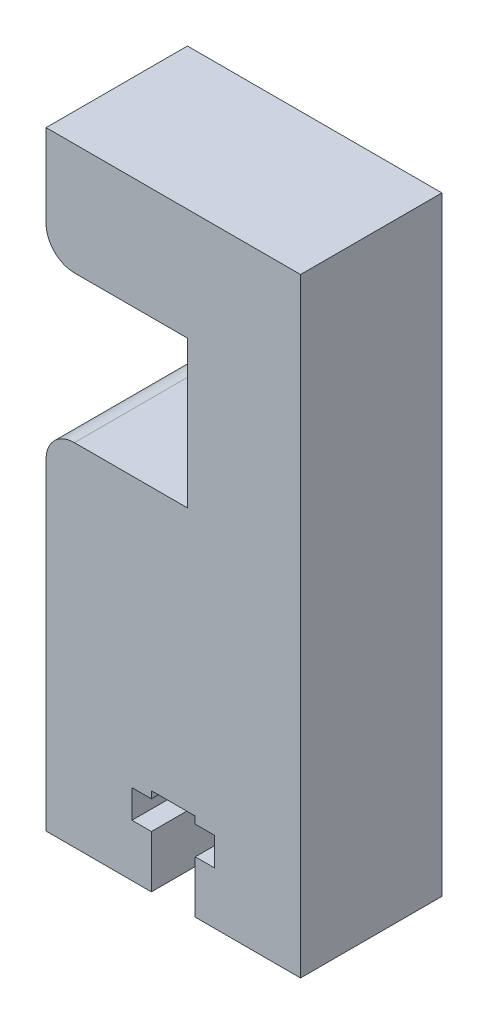
ISO-10303-21;
HEADER;
FILE_DESCRIPTION(('STEP AP214'),'2;1');
FILE_NAME('part.step','',(''),(''),'','','');
FILE_SCHEMA(('AUTOMOTIVE_DESIGN { 1 0 10303 214 1 1 1 1 }'));
ENDSEC;
DATA;
#1=APPLICATION_CONTEXT('core data for automotive mechanical design processes');
#2=APPLICATION_PROTOCOL_DEFINITION('international standard','automotive_design',2000,#1);
#3=PRODUCT_CONTEXT('',#1,'mechanical');
#4=PRODUCT('Part','Part','',(#3));
#5=PRODUCT_RELATED_PRODUCT_CATEGORY('part','',(#4));
#6=PRODUCT_DEFINITION_FORMATION('','',#4);
#7=PRODUCT_DEFINITION_CONTEXT('part definition',#1,'design');
#8=PRODUCT_DEFINITION('design','',#6,#7);
#9=PRODUCT_DEFINITION_SHAPE('','',#8);
#10=(LENGTH_UNIT() NAMED_UNIT(*) SI_UNIT(.MILLI.,.METRE.));
#11=(NAMED_UNIT(*) PLANE_ANGLE_UNIT() SI_UNIT($,.RADIAN.));
#12=(NAMED_UNIT(*) SI_UNIT($,.STERADIAN.) SOLID_ANGLE_UNIT());
#13=UNCERTAINTY_MEASURE_WITH_UNIT(LENGTH_MEASURE(1.E-05),#10,'distance_accuracy_value','');
#14=(GEOMETRIC_REPRESENTATION_CONTEXT(3) GLOBAL_UNCERTAINTY_ASSIGNED_CONTEXT((#13)) GLOBAL_UNIT_ASSIGNED_CONTEXT((#10,
#11,#12)) REPRESENTATION_CONTEXT('',''));
#15=CARTESIAN_POINT('',(0.,0.,0.));
#16=DIRECTION('',(0.,0.,1.));
#17=DIRECTION('',(1.,0.,0.));
#18=AXIS2_PLACEMENT_3D('',#15,#16,#17);
#19=CARTESIAN_POINT('',(-39.1463168418518,3.90000000000001,10.));
#20=DIRECTION('',(0.,1.,0.));
#21=DIRECTION('',(-1.,0.,0.));
#22=AXIS2_PLACEMENT_3D('',#19,#20,#21);
#23=PLANE('',#22);
#24=DIRECTION('',(1.,0.,0.));
#25=VECTOR('',#24,1.);
#26=CARTESIAN_POINT('',(-39.1463168418518,3.90000000000001,0.));
#27=LINE('',#26,#25);
#28=CARTESIAN_POINT('',(-57.1463168418518,3.90000000000001,0.));
#29=VERTEX_POINT('',#28);
#30=CARTESIAN_POINT('',(-49.6963168418518,3.90000000000001,0.));
#31=VERTEX_POINT('',#30);
#32=EDGE_CURVE('E163',#29,#31,#27,.T.);
#33=ORIENTED_EDGE('',*,*,#32,.T.);
#34=DIRECTION('',(0.,0.,1.));
#35=VECTOR('',#34,1.);
#36=CARTESIAN_POINT('',(-49.6963168418518,3.90000000000001,0.));
#37=LINE('',#36,#35);
#38=CARTESIAN_POINT('',(-49.6963168418518,3.90000000000001,10.));
#39=VERTEX_POINT('',#38);
#40=EDGE_CURVE('E160',#31,#39,#37,.T.);
#41=ORIENTED_EDGE('',*,*,#40,.T.);
#42=DIRECTION('',(1.,0.,0.));
#43=VECTOR('',#42,1.);
#44=CARTESIAN_POINT('',(-39.1463168418518,3.90000000000001,10.));
#45=LINE('',#44,#43);
#46=CARTESIAN_POINT('',(-57.1463168418518,3.90000000000001,10.));
#47=VERTEX_POINT('',#46);
#48=EDGE_CURVE('E198',#47,#39,#45,.T.);
#49=ORIENTED_EDGE('',*,*,#48,.F.);
#50=DIRECTION('',(0.,0.,-1.));
#51=VECTOR('',#50,1.);
#52=CARTESIAN_POINT('',(-57.1463168418518,3.90000000000001,10.));
#53=LINE('',#52,#51);
#54=EDGE_CURVE('E42',#47,#29,#53,.T.);
#55=ORIENTED_EDGE('',*,*,#54,.T.);
#56=EDGE_LOOP('',(#33,#41,#49,#55));
#57=FACE_BOUND('',#56,.T.);
#58=ADVANCED_FACE('F34',(#57),#23,.F.);
#59=CARTESIAN_POINT('',(-55.1463168418518,26.7,10.));
#60=DIRECTION('',(0.,0.,-1.));
#61=DIRECTION('',(-1.,0.,0.));
#62=AXIS2_PLACEMENT_3D('',#59,#60,#61);
#63=CYLINDRICAL_SURFACE('',#62,2.);
#64=CARTESIAN_POINT('',(-55.1463168418518,26.7,0.));
#65=DIRECTION('',(0.,0.,1.));
#66=DIRECTION('',(-1.,0.,0.));
#67=AXIS2_PLACEMENT_3D('',#64,#65,#66);
#68=CIRCLE('',#67,2.);
#69=CARTESIAN_POINT('',(-55.1463168418518,28.7,0.));
#70=VERTEX_POINT('',#69);
#71=CARTESIAN_POINT('',(-57.1463168418518,26.7,0.));
#72=VERTEX_POINT('',#71);
#73=EDGE_CURVE('E156',#70,#72,#68,.T.);
#74=ORIENTED_EDGE('',*,*,#73,.T.);
#75=DIRECTION('',(0.,0.,-1.));
#76=VECTOR('',#75,1.);
#77=CARTESIAN_POINT('',(-57.1463168418518,26.7,10.));
#78=LINE('',#77,#76);
#79=CARTESIAN_POINT('',(-57.1463168418518,26.7,10.));
#80=VERTEX_POINT('',#79);
#81=EDGE_CURVE('E11',#80,#72,#78,.T.);
#82=ORIENTED_EDGE('',*,*,#81,.F.);
#83=CARTESIAN_POINT('',(-55.1463168418518,26.7,10.));
#84=DIRECTION('',(0.,0.,1.));
#85=DIRECTION('',(-1.,0.,0.));
#86=AXIS2_PLACEMENT_3D('',#83,#84,#85);
#87=CIRCLE('',#86,2.);
#88=CARTESIAN_POINT('',(-55.1463168418518,28.7,10.));
#89=VERTEX_POINT('',#88);
#90=EDGE_CURVE('E178',#89,#80,#87,.T.);
#91=ORIENTED_EDGE('',*,*,#90,.F.);
#92=DIRECTION('',(0.,0.,-1.));
#93=VECTOR('',#92,1.);
#94=CARTESIAN_POINT('',(-55.1463168418518,28.7,10.));
#95=LINE('',#94,#93);
#96=EDGE_CURVE('E152',#89,#70,#95,.T.);
#97=ORIENTED_EDGE('',*,*,#96,.T.);
#98=EDGE_LOOP('',(#74,#82,#91,#97));
#99=FACE_BOUND('',#98,.T.);
#100=ADVANCED_FACE('F36',(#99),#63,.T.);
#101=CARTESIAN_POINT('',(-57.1463168418518,3.90000000000001,10.));
#102=DIRECTION('',(1.,0.,0.));
#103=DIRECTION('',(0.,0.,-1.));
#104=AXIS2_PLACEMENT_3D('',#101,#102,#103);
#105=PLANE('',#104);
#106=DIRECTION('',(0.,-1.,0.));
#107=VECTOR('',#106,1.);
#108=CARTESIAN_POINT('',(-57.1463168418518,3.90000000000001,0.));
#109=LINE('',#108,#107);
#110=EDGE_CURVE('E159',#72,#29,#109,.T.);
#111=ORIENTED_EDGE('',*,*,#110,.T.);
#112=ORIENTED_EDGE('',*,*,#54,.F.);
#113=DIRECTION('',(0.,-1.,0.));
#114=VECTOR('',#113,1.);
#115=CARTESIAN_POINT('',(-57.1463168418518,3.90000000000001,10.));
#116=LINE('',#115,#114);
#117=EDGE_CURVE('E105',#80,#47,#116,.T.);
#118=ORIENTED_EDGE('',*,*,#117,.F.);
#119=ORIENTED_EDGE('',*,*,#81,.T.);
#120=EDGE_LOOP('',(#111,#112,#118,#119));
#121=FACE_BOUND('',#120,.T.);
#122=ADVANCED_FACE('F441',(#121),#105,.F.);
#123=CARTESIAN_POINT('',(-46.5963168418518,3.90000000000001,10.));
#124=VERTEX_POINT('',#123);
#125=CARTESIAN_POINT('',(-39.1463168418518,3.90000000000001,10.));
#126=VERTEX_POINT('',#125);
#127=EDGE_CURVE('E287',#124,#126,#45,.T.);
#128=ORIENTED_EDGE('',*,*,#127,.F.);
#129=DIRECTION('',(0.,0.,1.));
#130=VECTOR('',#129,1.);
#131=CARTESIAN_POINT('',(-46.5963168418518,3.90000000000001,0.));
#132=LINE('',#131,#130);
#133=CARTESIAN_POINT('',(-46.5963168418518,3.90000000000001,0.));
#134=VERTEX_POINT('',#133);
#135=EDGE_CURVE('E214',#134,#124,#132,.T.);
#136=ORIENTED_EDGE('',*,*,#135,.F.);
#137=CARTESIAN_POINT('',(-39.1463168418518,3.90000000000001,0.));
#138=VERTEX_POINT('',#137);
#139=EDGE_CURVE('E162',#134,#138,#27,.T.);
#140=ORIENTED_EDGE('',*,*,#139,.T.);
#141=DIRECTION('',(0.,0.,-1.));
#142=VECTOR('',#141,1.);
#143=CARTESIAN_POINT('',(-39.1463168418518,3.90000000000001,10.));
#144=LINE('',#143,#142);
#145=EDGE_CURVE('E191',#126,#138,#144,.T.);
#146=ORIENTED_EDGE('',*,*,#145,.F.);
#147=EDGE_LOOP('',(#128,#136,#140,#146));
#148=FACE_BOUND('',#147,.T.);
#149=ADVANCED_FACE('F419',(#148),#23,.F.);
#150=CARTESIAN_POINT('',(-39.1463168418518,3.90000000000001,10.));
#151=DIRECTION('',(-1.,0.,0.));
#152=DIRECTION('',(0.,-1.,0.));
#153=AXIS2_PLACEMENT_3D('',#150,#151,#152);
#154=PLANE('',#153);
#155=DIRECTION('',(0.,1.,0.));
#156=VECTOR('',#155,1.);
#157=CARTESIAN_POINT('',(-39.1463168418518,3.90000000000001,0.));
#158=LINE('',#157,#156);
#159=CARTESIAN_POINT('',(-39.1463168418518,47.,0.));
#160=VERTEX_POINT('',#159);
#161=EDGE_CURVE('E166',#138,#160,#158,.T.);
#162=ORIENTED_EDGE('',*,*,#161,.T.);
#163=DIRECTION('',(0.,0.,-1.));
#164=VECTOR('',#163,1.);
#165=CARTESIAN_POINT('',(-39.1463168418518,47.,10.));
#166=LINE('',#165,#164);
#167=CARTESIAN_POINT('',(-39.1463168418518,47.,10.));
#168=VERTEX_POINT('',#167);
#169=EDGE_CURVE('E188',#168,#160,#166,.T.);
#170=ORIENTED_EDGE('',*,*,#169,.F.);
#171=DIRECTION('',(0.,1.,0.));
#172=VECTOR('',#171,1.);
#173=CARTESIAN_POINT('',(-39.1463168418518,3.90000000000001,10.));
#174=LINE('',#173,#172);
#175=EDGE_CURVE('E289',#126,#168,#174,.T.);
#176=ORIENTED_EDGE('',*,*,#175,.F.);
#177=ORIENTED_EDGE('',*,*,#145,.T.);
#178=EDGE_LOOP('',(#162,#170,#176,#177));
#179=FACE_BOUND('',#178,.T.);
#180=ADVANCED_FACE('F424',(#179),#154,.F.);
#181=CARTESIAN_POINT('',(-39.1463168418518,47.,10.));
#182=DIRECTION('',(0.,-1.,0.));
#183=DIRECTION('',(1.,0.,0.));
#184=AXIS2_PLACEMENT_3D('',#181,#182,#183);
#185=PLANE('',#184);
#186=DIRECTION('',(-1.,0.,0.));
#187=VECTOR('',#186,1.);
#188=CARTESIAN_POINT('',(-39.1463168418518,47.,0.));
#189=LINE('',#188,#187);
#190=CARTESIAN_POINT('',(-57.1463168418518,47.,0.));
#191=VERTEX_POINT('',#190);
#192=EDGE_CURVE('E168',#160,#191,#189,.T.);
#193=ORIENTED_EDGE('',*,*,#192,.T.);
#194=DIRECTION('',(0.,0.,-1.));
#195=VECTOR('',#194,1.);
#196=CARTESIAN_POINT('',(-57.1463168418518,47.,10.));
#197=LINE('',#196,#195);
#198=CARTESIAN_POINT('',(-57.1463168418518,47.,10.));
#199=VERTEX_POINT('',#198);
#200=EDGE_CURVE('E185',#199,#191,#197,.T.);
#201=ORIENTED_EDGE('',*,*,#200,.F.);
#202=DIRECTION('',(-1.,0.,0.));
#203=VECTOR('',#202,1.);
#204=CARTESIAN_POINT('',(-39.1463168418518,47.,10.));
#205=LINE('',#204,#203);
#206=EDGE_CURVE('E291',#168,#199,#205,.T.);
#207=ORIENTED_EDGE('',*,*,#206,.F.);
#208=ORIENTED_EDGE('',*,*,#169,.T.);
#209=EDGE_LOOP('',(#193,#201,#207,#208));
#210=FACE_BOUND('',#209,.T.);
#211=ADVANCED_FACE('F427',(#210),#185,.F.);
#212=CARTESIAN_POINT('',(-57.1463168418518,41.1,10.));
#213=DIRECTION('',(1.,0.,0.));
#214=DIRECTION('',(0.,0.,-1.));
#215=AXIS2_PLACEMENT_3D('',#212,#213,#214);
#216=PLANE('',#215);
#217=DIRECTION('',(0.,-1.,0.));
#218=VECTOR('',#217,1.);
#219=CARTESIAN_POINT('',(-57.1463168418518,41.1,0.));
#220=LINE('',#219,#218);
#221=CARTESIAN_POINT('',(-57.1463168418518,41.1,0.));
#222=VERTEX_POINT('',#221);
#223=EDGE_CURVE('E170',#191,#222,#220,.T.);
#224=ORIENTED_EDGE('',*,*,#223,.T.);
#225=DIRECTION('',(0.,0.,-1.));
#226=VECTOR('',#225,1.);
#227=CARTESIAN_POINT('',(-57.1463168418518,41.1,10.));
#228=LINE('',#227,#226);
#229=CARTESIAN_POINT('',(-57.1463168418518,41.1,10.));
#230=VERTEX_POINT('',#229);
#231=EDGE_CURVE('E182',#230,#222,#228,.T.);
#232=ORIENTED_EDGE('',*,*,#231,.F.);
#233=DIRECTION('',(0.,-1.,0.));
#234=VECTOR('',#233,1.);
#235=CARTESIAN_POINT('',(-57.1463168418518,41.1,10.));
#236=LINE('',#235,#234);
#237=EDGE_CURVE('E293',#199,#230,#236,.T.);
#238=ORIENTED_EDGE('',*,*,#237,.F.);
#239=ORIENTED_EDGE('',*,*,#200,.T.);
#240=EDGE_LOOP('',(#224,#232,#238,#239));
#241=FACE_BOUND('',#240,.T.);
#242=ADVANCED_FACE('F299',(#241),#216,.F.);
#243=CARTESIAN_POINT('',(-55.1463168418518,41.1,10.));
#244=DIRECTION('',(0.,0.,-1.));
#245=DIRECTION('',(-1.,0.,0.));
#246=AXIS2_PLACEMENT_3D('',#243,#244,#245);
#247=CYLINDRICAL_SURFACE('',#246,2.);
#248=CARTESIAN_POINT('',(-55.1463168418518,41.1,0.));
#249=DIRECTION('',(0.,0.,1.));
#250=DIRECTION('',(-1.,0.,0.));
#251=AXIS2_PLACEMENT_3D('',#248,#249,#250);
#252=CIRCLE('',#251,2.);
#253=CARTESIAN_POINT('',(-55.1463168418518,39.1,0.));
#254=VERTEX_POINT('',#253);
#255=EDGE_CURVE('E172',#222,#254,#252,.T.);
#256=ORIENTED_EDGE('',*,*,#255,.T.);
#257=DIRECTION('',(0.,0.,-1.));
#258=VECTOR('',#257,1.);
#259=CARTESIAN_POINT('',(-55.1463168418518,39.1,10.));
#260=LINE('',#259,#258);
#261=CARTESIAN_POINT('',(-55.1463168418518,39.1,10.));
#262=VERTEX_POINT('',#261);
#263=EDGE_CURVE('E147',#262,#254,#260,.T.);
#264=ORIENTED_EDGE('',*,*,#263,.F.);
#265=CARTESIAN_POINT('',(-55.1463168418518,41.1,10.));
#266=DIRECTION('',(0.,0.,1.));
#267=DIRECTION('',(-1.,0.,0.));
#268=AXIS2_PLACEMENT_3D('',#265,#266,#267);
#269=CIRCLE('',#268,2.);
#270=EDGE_CURVE('E135',#230,#262,#269,.T.);
#271=ORIENTED_EDGE('',*,*,#270,.F.);
#272=ORIENTED_EDGE('',*,*,#231,.T.);
#273=EDGE_LOOP('',(#256,#264,#271,#272));
#274=FACE_BOUND('',#273,.T.);
#275=ADVANCED_FACE('F303',(#274),#247,.T.);
#276=CARTESIAN_POINT('',(-55.1463168418518,39.1,10.));
#277=DIRECTION('',(0.,1.,0.));
#278=DIRECTION('',(0.,0.,1.));
#279=AXIS2_PLACEMENT_3D('',#276,#277,#278);
#280=PLANE('',#279);
#281=DIRECTION('',(1.,0.,0.));
#282=VECTOR('',#281,1.);
#283=CARTESIAN_POINT('',(-55.1463168418518,39.1,0.));
#284=LINE('',#283,#282);
#285=CARTESIAN_POINT('',(-47.1463168418518,39.1,0.));
#286=VERTEX_POINT('',#285);
#287=EDGE_CURVE('E144',#254,#286,#284,.T.);
#288=ORIENTED_EDGE('',*,*,#287,.T.);
#289=DIRECTION('',(0.,0.,-1.));
#290=VECTOR('',#289,1.);
#291=CARTESIAN_POINT('',(-47.1463168418518,39.1,10.));
#292=LINE('',#291,#290);
#293=CARTESIAN_POINT('',(-47.1463168418518,39.1,10.));
#294=VERTEX_POINT('',#293);
#295=EDGE_CURVE('E141',#294,#286,#292,.T.);
#296=ORIENTED_EDGE('',*,*,#295,.F.);
#297=DIRECTION('',(1.,0.,0.));
#298=VECTOR('',#297,1.);
#299=CARTESIAN_POINT('',(-55.1463168418518,39.1,10.));
#300=LINE('',#299,#298);
#301=EDGE_CURVE('E127',#262,#294,#300,.T.);
#302=ORIENTED_EDGE('',*,*,#301,.F.);
#303=ORIENTED_EDGE('',*,*,#263,.T.);
#304=EDGE_LOOP('',(#288,#296,#302,#303));
#305=FACE_BOUND('',#304,.T.);
#306=ADVANCED_FACE('F142',(#305),#280,.F.);
#307=CARTESIAN_POINT('',(-47.1463168418518,39.1,10.));
#308=DIRECTION('',(1.,0.,0.));
#309=DIRECTION('',(0.,0.,-1.));
#310=AXIS2_PLACEMENT_3D('',#307,#308,#309);
#311=PLANE('',#310);
#312=DIRECTION('',(0.,-1.,0.));
#313=VECTOR('',#312,1.);
#314=CARTESIAN_POINT('',(-47.1463168418518,39.1,0.));
#315=LINE('',#314,#313);
#316=CARTESIAN_POINT('',(-47.1463168418518,28.7,0.));
#317=VERTEX_POINT('',#316);
#318=EDGE_CURVE('E175',#286,#317,#315,.T.);
#319=ORIENTED_EDGE('',*,*,#318,.T.);
#320=DIRECTION('',(0.,0.,-1.));
#321=VECTOR('',#320,1.);
#322=CARTESIAN_POINT('',(-47.1463168418518,28.7,10.));
#323=LINE('',#322,#321);
#324=CARTESIAN_POINT('',(-47.1463168418518,28.7,10.));
#325=VERTEX_POINT('',#324);
#326=EDGE_CURVE('E148',#325,#317,#323,.T.);
#327=ORIENTED_EDGE('',*,*,#326,.F.);
#328=DIRECTION('',(0.,-1.,0.));
#329=VECTOR('',#328,1.);
#330=CARTESIAN_POINT('',(-47.1463168418518,39.1,10.));
#331=LINE('',#330,#329);
#332=EDGE_CURVE('E132',#294,#325,#331,.T.);
#333=ORIENTED_EDGE('',*,*,#332,.F.);
#334=ORIENTED_EDGE('',*,*,#295,.T.);
#335=EDGE_LOOP('',(#319,#327,#333,#334));
#336=FACE_BOUND('',#335,.T.);
#337=ADVANCED_FACE('F150',(#336),#311,.F.);
#338=CARTESIAN_POINT('',(-55.1463168418518,28.7,10.));
#339=DIRECTION('',(0.,-1.,0.));
#340=DIRECTION('',(1.,0.,0.));
#341=AXIS2_PLACEMENT_3D('',#338,#339,#340);
#342=PLANE('',#341);
#343=DIRECTION('',(-1.,0.,0.));
#344=VECTOR('',#343,1.);
#345=CARTESIAN_POINT('',(-55.1463168418518,28.7,0.));
#346=LINE('',#345,#344);
#347=EDGE_CURVE('E97',#317,#70,#346,.T.);
#348=ORIENTED_EDGE('',*,*,#347,.T.);
#349=ORIENTED_EDGE('',*,*,#96,.F.);
#350=DIRECTION('',(-1.,0.,0.));
#351=VECTOR('',#350,1.);
#352=CARTESIAN_POINT('',(-55.1463168418518,28.7,10.));
#353=LINE('',#352,#351);
#354=EDGE_CURVE('E58',#325,#89,#353,.T.);
#355=ORIENTED_EDGE('',*,*,#354,.F.);
#356=ORIENTED_EDGE('',*,*,#326,.T.);
#357=EDGE_LOOP('',(#348,#349,#355,#356));
#358=FACE_BOUND('',#357,.T.);
#359=ADVANCED_FACE('F304',(#358),#342,.F.);
#360=CARTESIAN_POINT('',(-55.1463168418518,26.7,10.));
#361=DIRECTION('',(0.,0.,-1.));
#362=DIRECTION('',(-1.,0.,0.));
#363=AXIS2_PLACEMENT_3D('',#360,#361,#362);
#364=PLANE('',#363);
#365=ORIENTED_EDGE('',*,*,#48,.T.);
#366=DIRECTION('',(0.,-1.,0.));
#367=VECTOR('',#366,1.);
#368=CARTESIAN_POINT('',(-49.6963168418518,3.90000000000001,10.));
#369=LINE('',#368,#367);
#370=CARTESIAN_POINT('',(-49.6963168418518,7.60000000000001,10.));
#371=VERTEX_POINT('',#370);
#372=EDGE_CURVE('E253',#371,#39,#369,.T.);
#373=ORIENTED_EDGE('',*,*,#372,.F.);
#374=DIRECTION('',(1.,0.,0.));
#375=VECTOR('',#374,1.);
#376=CARTESIAN_POINT('',(-49.6963168418518,7.60000000000001,10.));
#377=LINE('',#376,#375);
#378=CARTESIAN_POINT('',(-51.0713168418518,7.60000000000001,10.));
#379=VERTEX_POINT('',#378);
#380=EDGE_CURVE('E250',#379,#371,#377,.T.);
#381=ORIENTED_EDGE('',*,*,#380,.F.);
#382=DIRECTION('',(0.,-1.,0.));
#383=VECTOR('',#382,1.);
#384=CARTESIAN_POINT('',(-51.0713168418518,7.60000000000001,10.));
#385=LINE('',#384,#383);
#386=CARTESIAN_POINT('',(-51.0713168418518,9.60000000000001,10.));
#387=VERTEX_POINT('',#386);
#388=EDGE_CURVE('E247',#387,#379,#385,.T.);
#389=ORIENTED_EDGE('',*,*,#388,.F.);
#390=DIRECTION('',(-1.,0.,0.));
#391=VECTOR('',#390,1.);
#392=CARTESIAN_POINT('',(-49.6963168418518,9.60000000000001,10.));
#393=LINE('',#392,#391);
#394=CARTESIAN_POINT('',(-49.6963168418518,9.60000000000001,10.));
#395=VERTEX_POINT('',#394);
#396=EDGE_CURVE('E244',#395,#387,#393,.T.);
#397=ORIENTED_EDGE('',*,*,#396,.F.);
#398=DIRECTION('',(0.,-1.,0.));
#399=VECTOR('',#398,1.);
#400=CARTESIAN_POINT('',(-49.6963168418518,9.60000000000001,10.));
#401=LINE('',#400,#399);
#402=CARTESIAN_POINT('',(-49.6963168418518,10.1,10.));
#403=VERTEX_POINT('',#402);
#404=EDGE_CURVE('E241',#403,#395,#401,.T.);
#405=ORIENTED_EDGE('',*,*,#404,.F.);
#406=DIRECTION('',(-1.,0.,0.));
#407=VECTOR('',#406,1.);
#408=CARTESIAN_POINT('',(-46.5963168418518,10.1,10.));
#409=LINE('',#408,#407);
#410=CARTESIAN_POINT('',(-46.5963168418518,10.1,10.));
#411=VERTEX_POINT('',#410);
#412=EDGE_CURVE('E238',#411,#403,#409,.T.);
#413=ORIENTED_EDGE('',*,*,#412,.F.);
#414=DIRECTION('',(0.,1.,0.));
#415=VECTOR('',#414,1.);
#416=CARTESIAN_POINT('',(-46.5963168418518,9.60000000000001,10.));
#417=LINE('',#416,#415);
#418=CARTESIAN_POINT('',(-46.5963168418518,9.60000000000001,10.));
#419=VERTEX_POINT('',#418);
#420=EDGE_CURVE('E235',#419,#411,#417,.T.);
#421=ORIENTED_EDGE('',*,*,#420,.F.);
#422=DIRECTION('',(-1.,0.,0.));
#423=VECTOR('',#422,1.);
#424=CARTESIAN_POINT('',(-45.2213168418518,9.60000000000001,10.));
#425=LINE('',#424,#423);
#426=CARTESIAN_POINT('',(-45.2213168418518,9.60000000000001,10.));
#427=VERTEX_POINT('',#426);
#428=EDGE_CURVE('E232',#427,#419,#425,.T.);
#429=ORIENTED_EDGE('',*,*,#428,.F.);
#430=DIRECTION('',(0.,1.,0.));
#431=VECTOR('',#430,1.);
#432=CARTESIAN_POINT('',(-45.2213168418518,7.60000000000001,10.));
#433=LINE('',#432,#431);
#434=CARTESIAN_POINT('',(-45.2213168418518,7.60000000000001,10.));
#435=VERTEX_POINT('',#434);
#436=EDGE_CURVE('E229',#435,#427,#433,.T.);
#437=ORIENTED_EDGE('',*,*,#436,.F.);
#438=DIRECTION('',(1.,0.,0.));
#439=VECTOR('',#438,1.);
#440=CARTESIAN_POINT('',(-45.2213168418518,7.60000000000001,10.));
#441=LINE('',#440,#439);
#442=CARTESIAN_POINT('',(-46.5963168418518,7.60000000000001,10.));
#443=VERTEX_POINT('',#442);
#444=EDGE_CURVE('E226',#443,#435,#441,.T.);
#445=ORIENTED_EDGE('',*,*,#444,.F.);
#446=DIRECTION('',(0.,1.,0.));
#447=VECTOR('',#446,1.);
#448=CARTESIAN_POINT('',(-46.5963168418518,3.90000000000001,10.));
#449=LINE('',#448,#447);
#450=EDGE_CURVE('E223',#124,#443,#449,.T.);
#451=ORIENTED_EDGE('',*,*,#450,.F.);
#452=ORIENTED_EDGE('',*,*,#127,.T.);
#453=ORIENTED_EDGE('',*,*,#175,.T.);
#454=ORIENTED_EDGE('',*,*,#206,.T.);
#455=ORIENTED_EDGE('',*,*,#237,.T.);
#456=ORIENTED_EDGE('',*,*,#270,.T.);
#457=ORIENTED_EDGE('',*,*,#301,.T.);
#458=ORIENTED_EDGE('',*,*,#332,.T.);
#459=ORIENTED_EDGE('',*,*,#354,.T.);
#460=ORIENTED_EDGE('',*,*,#90,.T.);
#461=ORIENTED_EDGE('',*,*,#117,.T.);
#462=EDGE_LOOP('',(#365,#373,#381,#389,#397,#405,#413,#421,#429,#437,#445,#451,#452,#453,#454,
#455,#456,#457,#458,#459,#460,#461));
#463=FACE_BOUND('',#462,.T.);
#464=ADVANCED_FACE('F130',(#463),#364,.F.);
#465=CARTESIAN_POINT('',(-55.1463168418518,26.7,0.));
#466=DIRECTION('',(0.,0.,-1.));
#467=DIRECTION('',(-1.,0.,0.));
#468=AXIS2_PLACEMENT_3D('',#465,#466,#467);
#469=PLANE('',#468);
#470=DIRECTION('',(0.,-1.,0.));
#471=VECTOR('',#470,1.);
#472=CARTESIAN_POINT('',(-49.6963168418518,3.90000000000001,0.));
#473=LINE('',#472,#471);
#474=CARTESIAN_POINT('',(-49.6963168418518,7.60000000000001,0.));
#475=VERTEX_POINT('',#474);
#476=EDGE_CURVE('E205',#475,#31,#473,.T.);
#477=ORIENTED_EDGE('',*,*,#476,.T.);
#478=ORIENTED_EDGE('',*,*,#32,.F.);
#479=ORIENTED_EDGE('',*,*,#110,.F.);
#480=ORIENTED_EDGE('',*,*,#73,.F.);
#481=ORIENTED_EDGE('',*,*,#347,.F.);
#482=ORIENTED_EDGE('',*,*,#318,.F.);
#483=ORIENTED_EDGE('',*,*,#287,.F.);
#484=ORIENTED_EDGE('',*,*,#255,.F.);
#485=ORIENTED_EDGE('',*,*,#223,.F.);
#486=ORIENTED_EDGE('',*,*,#192,.F.);
#487=ORIENTED_EDGE('',*,*,#161,.F.);
#488=ORIENTED_EDGE('',*,*,#139,.F.);
#489=DIRECTION('',(0.,1.,0.));
#490=VECTOR('',#489,1.);
#491=CARTESIAN_POINT('',(-46.5963168418518,3.90000000000001,0.));
#492=LINE('',#491,#490);
#493=CARTESIAN_POINT('',(-46.5963168418518,7.60000000000001,0.));
#494=VERTEX_POINT('',#493);
#495=EDGE_CURVE('E256',#134,#494,#492,.T.);
#496=ORIENTED_EDGE('',*,*,#495,.T.);
#497=DIRECTION('',(1.,0.,0.));
#498=VECTOR('',#497,1.);
#499=CARTESIAN_POINT('',(-45.2213168418518,7.60000000000001,0.));
#500=LINE('',#499,#498);
#501=CARTESIAN_POINT('',(-45.2213168418518,7.60000000000001,0.));
#502=VERTEX_POINT('',#501);
#503=EDGE_CURVE('E49',#494,#502,#500,.T.);
#504=ORIENTED_EDGE('',*,*,#503,.T.);
#505=DIRECTION('',(0.,1.,0.));
#506=VECTOR('',#505,1.);
#507=CARTESIAN_POINT('',(-45.2213168418518,7.60000000000001,0.));
#508=LINE('',#507,#506);
#509=CARTESIAN_POINT('',(-45.2213168418518,9.60000000000001,0.));
#510=VERTEX_POINT('',#509);
#511=EDGE_CURVE('E365',#502,#510,#508,.T.);
#512=ORIENTED_EDGE('',*,*,#511,.T.);
#513=DIRECTION('',(-1.,0.,0.));
#514=VECTOR('',#513,1.);
#515=CARTESIAN_POINT('',(-45.2213168418518,9.60000000000001,0.));
#516=LINE('',#515,#514);
#517=CARTESIAN_POINT('',(-46.5963168418518,9.60000000000001,0.));
#518=VERTEX_POINT('',#517);
#519=EDGE_CURVE('E369',#510,#518,#516,.T.);
#520=ORIENTED_EDGE('',*,*,#519,.T.);
#521=DIRECTION('',(0.,1.,0.));
#522=VECTOR('',#521,1.);
#523=CARTESIAN_POINT('',(-46.5963168418518,9.60000000000001,0.));
#524=LINE('',#523,#522);
#525=CARTESIAN_POINT('',(-46.5963168418518,10.1,0.));
#526=VERTEX_POINT('',#525);
#527=EDGE_CURVE('E377',#518,#526,#524,.T.);
#528=ORIENTED_EDGE('',*,*,#527,.T.);
#529=DIRECTION('',(-1.,0.,0.));
#530=VECTOR('',#529,1.);
#531=CARTESIAN_POINT('',(-46.5963168418518,10.1,0.));
#532=LINE('',#531,#530);
#533=CARTESIAN_POINT('',(-49.6963168418518,10.1,0.));
#534=VERTEX_POINT('',#533);
#535=EDGE_CURVE('E380',#526,#534,#532,.T.);
#536=ORIENTED_EDGE('',*,*,#535,.T.);
#537=DIRECTION('',(0.,-1.,0.));
#538=VECTOR('',#537,1.);
#539=CARTESIAN_POINT('',(-49.6963168418518,9.60000000000001,0.));
#540=LINE('',#539,#538);
#541=CARTESIAN_POINT('',(-49.6963168418518,9.60000000000001,0.));
#542=VERTEX_POINT('',#541);
#543=EDGE_CURVE('E383',#534,#542,#540,.T.);
#544=ORIENTED_EDGE('',*,*,#543,.T.);
#545=DIRECTION('',(-1.,0.,0.));
#546=VECTOR('',#545,1.);
#547=CARTESIAN_POINT('',(-49.6963168418518,9.60000000000001,0.));
#548=LINE('',#547,#546);
#549=CARTESIAN_POINT('',(-51.0713168418518,9.60000000000001,0.));
#550=VERTEX_POINT('',#549);
#551=EDGE_CURVE('E386',#542,#550,#548,.T.);
#552=ORIENTED_EDGE('',*,*,#551,.T.);
#553=DIRECTION('',(0.,-1.,0.));
#554=VECTOR('',#553,1.);
#555=CARTESIAN_POINT('',(-51.0713168418518,7.60000000000001,0.));
#556=LINE('',#555,#554);
#557=CARTESIAN_POINT('',(-51.0713168418518,7.60000000000001,0.));
#558=VERTEX_POINT('',#557);
#559=EDGE_CURVE('E219',#550,#558,#556,.T.);
#560=ORIENTED_EDGE('',*,*,#559,.T.);
#561=DIRECTION('',(1.,0.,0.));
#562=VECTOR('',#561,1.);
#563=CARTESIAN_POINT('',(-49.6963168418518,7.60000000000001,0.));
#564=LINE('',#563,#562);
#565=EDGE_CURVE('E209',#558,#475,#564,.T.);
#566=ORIENTED_EDGE('',*,*,#565,.T.);
#567=EDGE_LOOP('',(#477,#478,#479,#480,#481,#482,#483,#484,#485,#486,#487,#488,#496,#504,#512,
#520,#528,#536,#544,#552,#560,#566));
#568=FACE_BOUND('',#567,.T.);
#569=ADVANCED_FACE('F201',(#568),#469,.T.);
#570=CARTESIAN_POINT('',(-49.6963168418518,3.90000000000001,0.));
#571=DIRECTION('',(-1.,0.,0.));
#572=DIRECTION('',(0.,0.,1.));
#573=AXIS2_PLACEMENT_3D('',#570,#571,#572);
#574=PLANE('',#573);
#575=ORIENTED_EDGE('',*,*,#372,.T.);
#576=ORIENTED_EDGE('',*,*,#40,.F.);
#577=ORIENTED_EDGE('',*,*,#476,.F.);
#578=DIRECTION('',(0.,0.,1.));
#579=VECTOR('',#578,1.);
#580=CARTESIAN_POINT('',(-49.6963168418518,7.60000000000001,0.));
#581=LINE('',#580,#579);
#582=EDGE_CURVE('E258',#475,#371,#581,.T.);
#583=ORIENTED_EDGE('',*,*,#582,.T.);
#584=EDGE_LOOP('',(#575,#576,#577,#583));
#585=FACE_BOUND('',#584,.T.);
#586=ADVANCED_FACE('F517',(#585),#574,.F.);
#587=CARTESIAN_POINT('',(-49.6963168418518,7.60000000000001,0.));
#588=DIRECTION('',(0.,-1.,0.));
#589=DIRECTION('',(0.,0.,-1.));
#590=AXIS2_PLACEMENT_3D('',#587,#588,#589);
#591=PLANE('',#590);
#592=ORIENTED_EDGE('',*,*,#380,.T.);
#593=ORIENTED_EDGE('',*,*,#582,.F.);
#594=ORIENTED_EDGE('',*,*,#565,.F.);
#595=DIRECTION('',(0.,0.,1.));
#596=VECTOR('',#595,1.);
#597=CARTESIAN_POINT('',(-51.0713168418518,7.60000000000001,0.));
#598=LINE('',#597,#596);
#599=EDGE_CURVE('E260',#558,#379,#598,.T.);
#600=ORIENTED_EDGE('',*,*,#599,.T.);
#601=EDGE_LOOP('',(#592,#593,#594,#600));
#602=FACE_BOUND('',#601,.T.);
#603=ADVANCED_FACE('F394',(#602),#591,.F.);
#604=CARTESIAN_POINT('',(-51.0713168418518,7.60000000000001,0.));
#605=DIRECTION('',(-1.,0.,0.));
#606=DIRECTION('',(0.,0.,1.));
#607=AXIS2_PLACEMENT_3D('',#604,#605,#606);
#608=PLANE('',#607);
#609=ORIENTED_EDGE('',*,*,#388,.T.);
#610=ORIENTED_EDGE('',*,*,#599,.F.);
#611=ORIENTED_EDGE('',*,*,#559,.F.);
#612=DIRECTION('',(0.,0.,1.));
#613=VECTOR('',#612,1.);
#614=CARTESIAN_POINT('',(-51.0713168418518,9.60000000000001,0.));
#615=LINE('',#614,#613);
#616=EDGE_CURVE('E263',#550,#387,#615,.T.);
#617=ORIENTED_EDGE('',*,*,#616,.T.);
#618=EDGE_LOOP('',(#609,#610,#611,#617));
#619=FACE_BOUND('',#618,.T.);
#620=ADVANCED_FACE('F391',(#619),#608,.F.);
#621=CARTESIAN_POINT('',(-49.6963168418518,9.60000000000001,0.));
#622=DIRECTION('',(0.,1.,0.));
#623=DIRECTION('',(0.,0.,1.));
#624=AXIS2_PLACEMENT_3D('',#621,#622,#623);
#625=PLANE('',#624);
#626=ORIENTED_EDGE('',*,*,#396,.T.);
#627=ORIENTED_EDGE('',*,*,#616,.F.);
#628=ORIENTED_EDGE('',*,*,#551,.F.);
#629=DIRECTION('',(0.,0.,1.));
#630=VECTOR('',#629,1.);
#631=CARTESIAN_POINT('',(-49.6963168418518,9.60000000000001,0.));
#632=LINE('',#631,#630);
#633=EDGE_CURVE('E266',#542,#395,#632,.T.);
#634=ORIENTED_EDGE('',*,*,#633,.T.);
#635=EDGE_LOOP('',(#626,#627,#628,#634));
#636=FACE_BOUND('',#635,.T.);
#637=ADVANCED_FACE('F399',(#636),#625,.F.);
#638=CARTESIAN_POINT('',(-49.6963168418518,9.60000000000001,0.));
#639=DIRECTION('',(-1.,0.,0.));
#640=DIRECTION('',(0.,0.,1.));
#641=AXIS2_PLACEMENT_3D('',#638,#639,#640);
#642=PLANE('',#641);
#643=ORIENTED_EDGE('',*,*,#404,.T.);
#644=ORIENTED_EDGE('',*,*,#633,.F.);
#645=ORIENTED_EDGE('',*,*,#543,.F.);
#646=DIRECTION('',(0.,0.,1.));
#647=VECTOR('',#646,1.);
#648=CARTESIAN_POINT('',(-49.6963168418518,10.1,0.));
#649=LINE('',#648,#647);
#650=EDGE_CURVE('E269',#534,#403,#649,.T.);
#651=ORIENTED_EDGE('',*,*,#650,.T.);
#652=EDGE_LOOP('',(#643,#644,#645,#651));
#653=FACE_BOUND('',#652,.T.);
#654=ADVANCED_FACE('F402',(#653),#642,.F.);
#655=CARTESIAN_POINT('',(-46.5963168418518,10.1,0.));
#656=DIRECTION('',(0.,1.,0.));
#657=DIRECTION('',(0.,0.,1.));
#658=AXIS2_PLACEMENT_3D('',#655,#656,#657);
#659=PLANE('',#658);
#660=ORIENTED_EDGE('',*,*,#412,.T.);
#661=ORIENTED_EDGE('',*,*,#650,.F.);
#662=ORIENTED_EDGE('',*,*,#535,.F.);
#663=DIRECTION('',(0.,0.,1.));
#664=VECTOR('',#663,1.);
#665=CARTESIAN_POINT('',(-46.5963168418518,10.1,0.));
#666=LINE('',#665,#664);
#667=EDGE_CURVE('E272',#526,#411,#666,.T.);
#668=ORIENTED_EDGE('',*,*,#667,.T.);
#669=EDGE_LOOP('',(#660,#661,#662,#668));
#670=FACE_BOUND('',#669,.T.);
#671=ADVANCED_FACE('F405',(#670),#659,.F.);
#672=CARTESIAN_POINT('',(-46.5963168418518,9.60000000000001,0.));
#673=DIRECTION('',(1.,0.,0.));
#674=DIRECTION('',(0.,0.,-1.));
#675=AXIS2_PLACEMENT_3D('',#672,#673,#674);
#676=PLANE('',#675);
#677=ORIENTED_EDGE('',*,*,#420,.T.);
#678=ORIENTED_EDGE('',*,*,#667,.F.);
#679=ORIENTED_EDGE('',*,*,#527,.F.);
#680=DIRECTION('',(0.,0.,1.));
#681=VECTOR('',#680,1.);
#682=CARTESIAN_POINT('',(-46.5963168418518,9.60000000000001,0.));
#683=LINE('',#682,#681);
#684=EDGE_CURVE('E275',#518,#419,#683,.T.);
#685=ORIENTED_EDGE('',*,*,#684,.T.);
#686=EDGE_LOOP('',(#677,#678,#679,#685));
#687=FACE_BOUND('',#686,.T.);
#688=ADVANCED_FACE('F409',(#687),#676,.F.);
#689=CARTESIAN_POINT('',(-45.2213168418518,9.60000000000001,0.));
#690=DIRECTION('',(0.,1.,0.));
#691=DIRECTION('',(0.,0.,1.));
#692=AXIS2_PLACEMENT_3D('',#689,#690,#691);
#693=PLANE('',#692);
#694=ORIENTED_EDGE('',*,*,#428,.T.);
#695=ORIENTED_EDGE('',*,*,#684,.F.);
#696=ORIENTED_EDGE('',*,*,#519,.F.);
#697=DIRECTION('',(0.,0.,1.));
#698=VECTOR('',#697,1.);
#699=CARTESIAN_POINT('',(-45.2213168418518,9.60000000000001,0.));
#700=LINE('',#699,#698);
#701=EDGE_CURVE('E278',#510,#427,#700,.T.);
#702=ORIENTED_EDGE('',*,*,#701,.T.);
#703=EDGE_LOOP('',(#694,#695,#696,#702));
#704=FACE_BOUND('',#703,.T.);
#705=ADVANCED_FACE('F412',(#704),#693,.F.);
#706=CARTESIAN_POINT('',(-45.2213168418518,7.60000000000001,0.));
#707=DIRECTION('',(1.,0.,0.));
#708=DIRECTION('',(0.,0.,-1.));
#709=AXIS2_PLACEMENT_3D('',#706,#707,#708);
#710=PLANE('',#709);
#711=ORIENTED_EDGE('',*,*,#436,.T.);
#712=ORIENTED_EDGE('',*,*,#701,.F.);
#713=ORIENTED_EDGE('',*,*,#511,.F.);
#714=DIRECTION('',(0.,0.,1.));
#715=VECTOR('',#714,1.);
#716=CARTESIAN_POINT('',(-45.2213168418518,7.60000000000001,0.));
#717=LINE('',#716,#715);
#718=EDGE_CURVE('E281',#502,#435,#717,.T.);
#719=ORIENTED_EDGE('',*,*,#718,.T.);
#720=EDGE_LOOP('',(#711,#712,#713,#719));
#721=FACE_BOUND('',#720,.T.);
#722=ADVANCED_FACE('F366',(#721),#710,.F.);
#723=CARTESIAN_POINT('',(-45.2213168418518,7.60000000000001,0.));
#724=DIRECTION('',(0.,-1.,0.));
#725=DIRECTION('',(0.,0.,-1.));
#726=AXIS2_PLACEMENT_3D('',#723,#724,#725);
#727=PLANE('',#726);
#728=ORIENTED_EDGE('',*,*,#444,.T.);
#729=ORIENTED_EDGE('',*,*,#718,.F.);
#730=ORIENTED_EDGE('',*,*,#503,.F.);
#731=DIRECTION('',(0.,0.,1.));
#732=VECTOR('',#731,1.);
#733=CARTESIAN_POINT('',(-46.5963168418518,7.60000000000001,0.));
#734=LINE('',#733,#732);
#735=EDGE_CURVE('E217',#494,#443,#734,.T.);
#736=ORIENTED_EDGE('',*,*,#735,.T.);
#737=EDGE_LOOP('',(#728,#729,#730,#736));
#738=FACE_BOUND('',#737,.T.);
#739=ADVANCED_FACE('F360',(#738),#727,.F.);
#740=CARTESIAN_POINT('',(-46.5963168418518,3.90000000000001,0.));
#741=DIRECTION('',(1.,0.,0.));
#742=DIRECTION('',(0.,0.,-1.));
#743=AXIS2_PLACEMENT_3D('',#740,#741,#742);
#744=PLANE('',#743);
#745=ORIENTED_EDGE('',*,*,#450,.T.);
#746=ORIENTED_EDGE('',*,*,#735,.F.);
#747=ORIENTED_EDGE('',*,*,#495,.F.);
#748=ORIENTED_EDGE('',*,*,#135,.T.);
#749=EDGE_LOOP('',(#745,#746,#747,#748));
#750=FACE_BOUND('',#749,.T.);
#751=ADVANCED_FACE('F592',(#750),#744,.F.);
#752=CLOSED_SHELL('',(#58,#100,#122,#149,#180,#211,#242,#275,#306,#337,#359,#464,#569,#586,#603,
#620,#637,#654,#671,#688,#705,#722,#739,#751));
#753=MANIFOLD_SOLID_BREP('B2',#752);
#754=ADVANCED_BREP_SHAPE_REPRESENTATION('',(#18,#753),#14);
#755=SHAPE_DEFINITION_REPRESENTATION(#9,#754);
ENDSEC;
END-ISO-10303-21;
